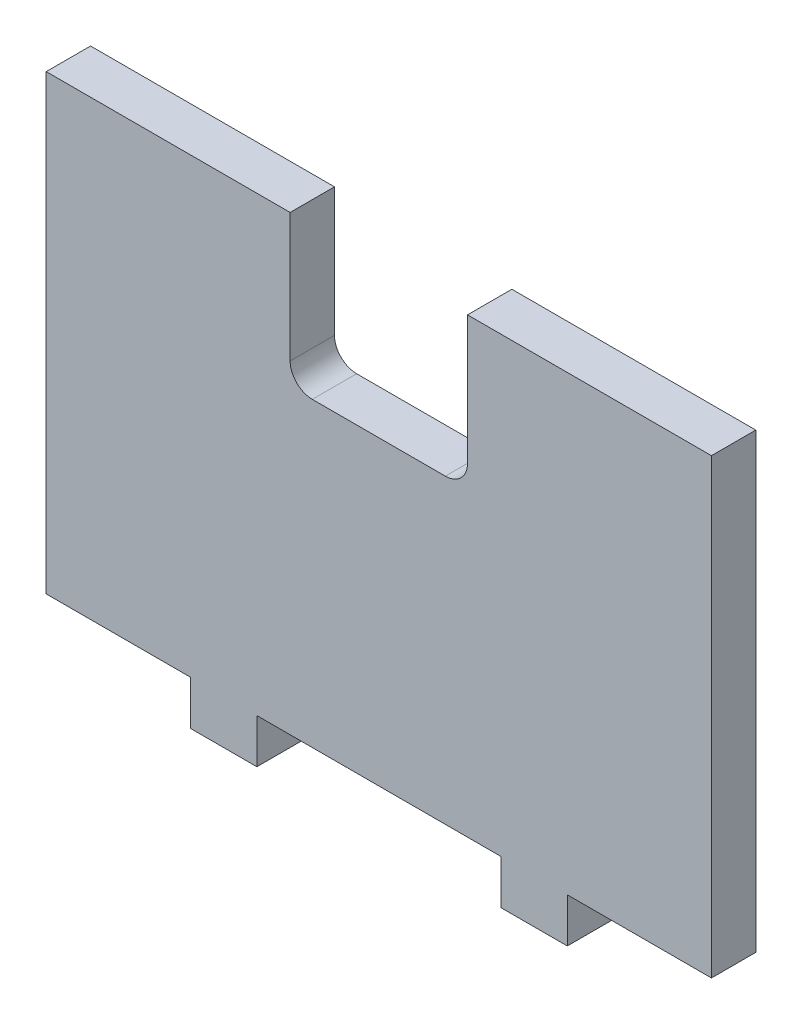
ISO-10303-21;
HEADER;
FILE_DESCRIPTION(('STEP AP214'),'2;1');
FILE_NAME('part.step','',(''),(''),'','','');
FILE_SCHEMA(('AUTOMOTIVE_DESIGN { 1 0 10303 214 1 1 1 1 }'));
ENDSEC;
DATA;
#1=APPLICATION_CONTEXT('core data for automotive mechanical design processes');
#2=APPLICATION_PROTOCOL_DEFINITION('international standard','automotive_design',2000,#1);
#3=PRODUCT_CONTEXT('',#1,'mechanical');
#4=PRODUCT('Part','Part','',(#3));
#5=PRODUCT_RELATED_PRODUCT_CATEGORY('part','',(#4));
#6=PRODUCT_DEFINITION_FORMATION('','',#4);
#7=PRODUCT_DEFINITION_CONTEXT('part definition',#1,'design');
#8=PRODUCT_DEFINITION('design','',#6,#7);
#9=PRODUCT_DEFINITION_SHAPE('','',#8);
#10=(LENGTH_UNIT() NAMED_UNIT(*) SI_UNIT(.MILLI.,.METRE.));
#11=(NAMED_UNIT(*) PLANE_ANGLE_UNIT() SI_UNIT($,.RADIAN.));
#12=(NAMED_UNIT(*) SI_UNIT($,.STERADIAN.) SOLID_ANGLE_UNIT());
#13=UNCERTAINTY_MEASURE_WITH_UNIT(LENGTH_MEASURE(1.E-05),#10,'distance_accuracy_value','');
#14=(GEOMETRIC_REPRESENTATION_CONTEXT(3) GLOBAL_UNCERTAINTY_ASSIGNED_CONTEXT((#13)) GLOBAL_UNIT_ASSIGNED_CONTEXT((#10,
#11,#12)) REPRESENTATION_CONTEXT('',''));
#15=CARTESIAN_POINT('',(0.,0.,0.));
#16=DIRECTION('',(0.,0.,1.));
#17=DIRECTION('',(1.,0.,0.));
#18=AXIS2_PLACEMENT_3D('',#15,#16,#17);
#19=CARTESIAN_POINT('',(-95.25,142.24,-12.7));
#20=DIRECTION('',(0.,1.,0.));
#21=DIRECTION('',(0.,0.,1.));
#22=AXIS2_PLACEMENT_3D('',#19,#20,#21);
#23=PLANE('',#22);
#24=DIRECTION('',(0.,0.,1.));
#25=VECTOR('',#24,1.);
#26=CARTESIAN_POINT('',(-25.3999999999998,142.24,-12.7));
#27=LINE('',#26,#25);
#28=CARTESIAN_POINT('',(-25.3999999999998,142.24,-12.7));
#29=VERTEX_POINT('',#28);
#30=CARTESIAN_POINT('',(-25.3999999999998,142.24,0.));
#31=VERTEX_POINT('',#30);
#32=EDGE_CURVE('E180',#29,#31,#27,.T.);
#33=ORIENTED_EDGE('',*,*,#32,.F.);
#34=DIRECTION('',(-1.,0.,0.));
#35=VECTOR('',#34,1.);
#36=CARTESIAN_POINT('',(-95.25,142.24,-12.7));
#37=LINE('',#36,#35);
#38=CARTESIAN_POINT('',(-95.25,142.24,-12.7));
#39=VERTEX_POINT('',#38);
#40=EDGE_CURVE('E186',#29,#39,#37,.T.);
#41=ORIENTED_EDGE('',*,*,#40,.T.);
#42=DIRECTION('',(0.,0.,1.));
#43=VECTOR('',#42,1.);
#44=CARTESIAN_POINT('',(-95.25,142.24,-12.7));
#45=LINE('',#44,#43);
#46=CARTESIAN_POINT('',(-95.25,142.24,0.));
#47=VERTEX_POINT('',#46);
#48=EDGE_CURVE('E231',#39,#47,#45,.T.);
#49=ORIENTED_EDGE('',*,*,#48,.T.);
#50=DIRECTION('',(-1.,0.,0.));
#51=VECTOR('',#50,1.);
#52=CARTESIAN_POINT('',(-95.25,142.24,0.));
#53=LINE('',#52,#51);
#54=EDGE_CURVE('E227',#31,#47,#53,.T.);
#55=ORIENTED_EDGE('',*,*,#54,.F.);
#56=EDGE_LOOP('',(#33,#41,#49,#55));
#57=FACE_BOUND('',#56,.T.);
#58=ADVANCED_FACE('F33',(#57),#23,.T.);
#59=CARTESIAN_POINT('',(-95.25,142.24,-12.7));
#60=DIRECTION('',(-1.,0.,0.));
#61=DIRECTION('',(0.,-1.,0.));
#62=AXIS2_PLACEMENT_3D('',#59,#60,#61);
#63=PLANE('',#62);
#64=DIRECTION('',(0.,-1.,0.));
#65=VECTOR('',#64,1.);
#66=CARTESIAN_POINT('',(-95.25,142.24,0.));
#67=LINE('',#66,#65);
#68=CARTESIAN_POINT('',(-95.25,12.7,0.));
#69=VERTEX_POINT('',#68);
#70=EDGE_CURVE('E194',#47,#69,#67,.T.);
#71=ORIENTED_EDGE('',*,*,#70,.F.);
#72=ORIENTED_EDGE('',*,*,#48,.F.);
#73=DIRECTION('',(0.,-1.,0.));
#74=VECTOR('',#73,1.);
#75=CARTESIAN_POINT('',(-95.25,142.24,-12.7));
#76=LINE('',#75,#74);
#77=CARTESIAN_POINT('',(-95.25,12.7,-12.7));
#78=VERTEX_POINT('',#77);
#79=EDGE_CURVE('E230',#39,#78,#76,.T.);
#80=ORIENTED_EDGE('',*,*,#79,.T.);
#81=DIRECTION('',(0.,0.,1.));
#82=VECTOR('',#81,1.);
#83=CARTESIAN_POINT('',(-95.25,12.7,-12.7));
#84=LINE('',#83,#82);
#85=EDGE_CURVE('E185',#78,#69,#84,.T.);
#86=ORIENTED_EDGE('',*,*,#85,.T.);
#87=EDGE_LOOP('',(#71,#72,#80,#86));
#88=FACE_BOUND('',#87,.T.);
#89=ADVANCED_FACE('F283',(#88),#63,.T.);
#90=DIRECTION('',(0.,0.,1.));
#91=VECTOR('',#90,1.);
#92=CARTESIAN_POINT('',(25.3999999999998,142.24,-12.7));
#93=LINE('',#92,#91);
#94=CARTESIAN_POINT('',(25.3999999999998,142.24,-12.7));
#95=VERTEX_POINT('',#94);
#96=CARTESIAN_POINT('',(25.3999999999998,142.24,0.));
#97=VERTEX_POINT('',#96);
#98=EDGE_CURVE('E170',#95,#97,#93,.T.);
#99=ORIENTED_EDGE('',*,*,#98,.T.);
#100=CARTESIAN_POINT('',(95.25,142.24,0.));
#101=VERTEX_POINT('',#100);
#102=EDGE_CURVE('E228',#101,#97,#53,.T.);
#103=ORIENTED_EDGE('',*,*,#102,.F.);
#104=DIRECTION('',(0.,0.,1.));
#105=VECTOR('',#104,1.);
#106=CARTESIAN_POINT('',(95.25,142.24,-12.7));
#107=LINE('',#106,#105);
#108=CARTESIAN_POINT('',(95.25,142.24,-12.7));
#109=VERTEX_POINT('',#108);
#110=EDGE_CURVE('E183',#109,#101,#107,.T.);
#111=ORIENTED_EDGE('',*,*,#110,.F.);
#112=EDGE_CURVE('E163',#109,#95,#37,.T.);
#113=ORIENTED_EDGE('',*,*,#112,.T.);
#114=EDGE_LOOP('',(#99,#103,#111,#113));
#115=FACE_BOUND('',#114,.T.);
#116=ADVANCED_FACE('F182',(#115),#23,.T.);
#117=CARTESIAN_POINT('',(95.25,142.24,-12.7));
#118=DIRECTION('',(1.,0.,0.));
#119=DIRECTION('',(0.,1.,0.));
#120=AXIS2_PLACEMENT_3D('',#117,#118,#119);
#121=PLANE('',#120);
#122=DIRECTION('',(0.,1.,0.));
#123=VECTOR('',#122,1.);
#124=CARTESIAN_POINT('',(95.25,142.24,0.));
#125=LINE('',#124,#123);
#126=CARTESIAN_POINT('',(95.25,12.7,0.));
#127=VERTEX_POINT('',#126);
#128=EDGE_CURVE('E224',#127,#101,#125,.T.);
#129=ORIENTED_EDGE('',*,*,#128,.F.);
#130=DIRECTION('',(0.,0.,1.));
#131=VECTOR('',#130,1.);
#132=CARTESIAN_POINT('',(95.25,12.7,-12.7));
#133=LINE('',#132,#131);
#134=CARTESIAN_POINT('',(95.25,12.7,-12.7));
#135=VERTEX_POINT('',#134);
#136=EDGE_CURVE('E236',#135,#127,#133,.T.);
#137=ORIENTED_EDGE('',*,*,#136,.F.);
#138=DIRECTION('',(0.,1.,0.));
#139=VECTOR('',#138,1.);
#140=CARTESIAN_POINT('',(95.25,142.24,-12.7));
#141=LINE('',#140,#139);
#142=EDGE_CURVE('E190',#135,#109,#141,.T.);
#143=ORIENTED_EDGE('',*,*,#142,.T.);
#144=ORIENTED_EDGE('',*,*,#110,.T.);
#145=EDGE_LOOP('',(#129,#137,#143,#144));
#146=FACE_BOUND('',#145,.T.);
#147=ADVANCED_FACE('F294',(#146),#121,.T.);
#148=CARTESIAN_POINT('',(53.975,12.7,-12.7));
#149=DIRECTION('',(0.,-1.,0.));
#150=DIRECTION('',(0.,0.,-1.));
#151=AXIS2_PLACEMENT_3D('',#148,#149,#150);
#152=PLANE('',#151);
#153=DIRECTION('',(1.,0.,0.));
#154=VECTOR('',#153,1.);
#155=CARTESIAN_POINT('',(53.975,12.7,0.));
#156=LINE('',#155,#154);
#157=CARTESIAN_POINT('',(53.975,12.7,0.));
#158=VERTEX_POINT('',#157);
#159=EDGE_CURVE('E221',#158,#127,#156,.T.);
#160=ORIENTED_EDGE('',*,*,#159,.F.);
#161=DIRECTION('',(0.,0.,1.));
#162=VECTOR('',#161,1.);
#163=CARTESIAN_POINT('',(53.975,12.7,-12.7));
#164=LINE('',#163,#162);
#165=CARTESIAN_POINT('',(53.975,12.7,-12.7));
#166=VERTEX_POINT('',#165);
#167=EDGE_CURVE('E238',#166,#158,#164,.T.);
#168=ORIENTED_EDGE('',*,*,#167,.F.);
#169=DIRECTION('',(1.,0.,0.));
#170=VECTOR('',#169,1.);
#171=CARTESIAN_POINT('',(53.975,12.7,-12.7));
#172=LINE('',#171,#170);
#173=EDGE_CURVE('E376',#166,#135,#172,.T.);
#174=ORIENTED_EDGE('',*,*,#173,.T.);
#175=ORIENTED_EDGE('',*,*,#136,.T.);
#176=EDGE_LOOP('',(#160,#168,#174,#175));
#177=FACE_BOUND('',#176,.T.);
#178=ADVANCED_FACE('F298',(#177),#152,.T.);
#179=CARTESIAN_POINT('',(53.975,0.,-12.7));
#180=DIRECTION('',(1.,0.,0.));
#181=DIRECTION('',(0.,0.,-1.));
#182=AXIS2_PLACEMENT_3D('',#179,#180,#181);
#183=PLANE('',#182);
#184=DIRECTION('',(0.,1.,0.));
#185=VECTOR('',#184,1.);
#186=CARTESIAN_POINT('',(53.975,0.,0.));
#187=LINE('',#186,#185);
#188=CARTESIAN_POINT('',(53.975,0.,0.));
#189=VERTEX_POINT('',#188);
#190=EDGE_CURVE('E218',#189,#158,#187,.T.);
#191=ORIENTED_EDGE('',*,*,#190,.F.);
#192=DIRECTION('',(0.,0.,1.));
#193=VECTOR('',#192,1.);
#194=CARTESIAN_POINT('',(53.975,0.,-12.7));
#195=LINE('',#194,#193);
#196=CARTESIAN_POINT('',(53.975,0.,-12.7));
#197=VERTEX_POINT('',#196);
#198=EDGE_CURVE('E240',#197,#189,#195,.T.);
#199=ORIENTED_EDGE('',*,*,#198,.F.);
#200=DIRECTION('',(0.,1.,0.));
#201=VECTOR('',#200,1.);
#202=CARTESIAN_POINT('',(53.975,0.,-12.7));
#203=LINE('',#202,#201);
#204=EDGE_CURVE('E374',#197,#166,#203,.T.);
#205=ORIENTED_EDGE('',*,*,#204,.T.);
#206=ORIENTED_EDGE('',*,*,#167,.T.);
#207=EDGE_LOOP('',(#191,#199,#205,#206));
#208=FACE_BOUND('',#207,.T.);
#209=ADVANCED_FACE('F303',(#208),#183,.T.);
#210=CARTESIAN_POINT('',(53.975,0.,-12.7));
#211=DIRECTION('',(0.,-1.,0.));
#212=DIRECTION('',(0.,0.,-1.));
#213=AXIS2_PLACEMENT_3D('',#210,#211,#212);
#214=PLANE('',#213);
#215=DIRECTION('',(1.,0.,0.));
#216=VECTOR('',#215,1.);
#217=CARTESIAN_POINT('',(53.975,0.,0.));
#218=LINE('',#217,#216);
#219=CARTESIAN_POINT('',(34.9249999999999,0.,0.));
#220=VERTEX_POINT('',#219);
#221=EDGE_CURVE('E215',#220,#189,#218,.T.);
#222=ORIENTED_EDGE('',*,*,#221,.F.);
#223=DIRECTION('',(0.,0.,1.));
#224=VECTOR('',#223,1.);
#225=CARTESIAN_POINT('',(34.9249999999999,0.,-12.7));
#226=LINE('',#225,#224);
#227=CARTESIAN_POINT('',(34.9249999999999,0.,-12.7));
#228=VERTEX_POINT('',#227);
#229=EDGE_CURVE('E242',#228,#220,#226,.T.);
#230=ORIENTED_EDGE('',*,*,#229,.F.);
#231=DIRECTION('',(1.,0.,0.));
#232=VECTOR('',#231,1.);
#233=CARTESIAN_POINT('',(53.975,0.,-12.7));
#234=LINE('',#233,#232);
#235=EDGE_CURVE('E371',#228,#197,#234,.T.);
#236=ORIENTED_EDGE('',*,*,#235,.T.);
#237=ORIENTED_EDGE('',*,*,#198,.T.);
#238=EDGE_LOOP('',(#222,#230,#236,#237));
#239=FACE_BOUND('',#238,.T.);
#240=ADVANCED_FACE('F310',(#239),#214,.T.);
#241=CARTESIAN_POINT('',(34.9249999999999,0.,-12.7));
#242=DIRECTION('',(-1.,0.,0.));
#243=DIRECTION('',(0.,0.,1.));
#244=AXIS2_PLACEMENT_3D('',#241,#242,#243);
#245=PLANE('',#244);
#246=DIRECTION('',(0.,-1.,0.));
#247=VECTOR('',#246,1.);
#248=CARTESIAN_POINT('',(34.9249999999999,0.,0.));
#249=LINE('',#248,#247);
#250=CARTESIAN_POINT('',(34.9249999999999,12.7,0.));
#251=VERTEX_POINT('',#250);
#252=EDGE_CURVE('E212',#251,#220,#249,.T.);
#253=ORIENTED_EDGE('',*,*,#252,.F.);
#254=DIRECTION('',(0.,0.,1.));
#255=VECTOR('',#254,1.);
#256=CARTESIAN_POINT('',(34.9249999999999,12.7,-12.7));
#257=LINE('',#256,#255);
#258=CARTESIAN_POINT('',(34.9249999999999,12.7,-12.7));
#259=VERTEX_POINT('',#258);
#260=EDGE_CURVE('E244',#259,#251,#257,.T.);
#261=ORIENTED_EDGE('',*,*,#260,.F.);
#262=DIRECTION('',(0.,-1.,0.));
#263=VECTOR('',#262,1.);
#264=CARTESIAN_POINT('',(34.9249999999999,0.,-12.7));
#265=LINE('',#264,#263);
#266=EDGE_CURVE('E368',#259,#228,#265,.T.);
#267=ORIENTED_EDGE('',*,*,#266,.T.);
#268=ORIENTED_EDGE('',*,*,#229,.T.);
#269=EDGE_LOOP('',(#253,#261,#267,#268));
#270=FACE_BOUND('',#269,.T.);
#271=ADVANCED_FACE('F314',(#270),#245,.T.);
#272=CARTESIAN_POINT('',(-34.9250000000001,12.7,-12.7));
#273=DIRECTION('',(0.,-1.,0.));
#274=DIRECTION('',(0.,0.,-1.));
#275=AXIS2_PLACEMENT_3D('',#272,#273,#274);
#276=PLANE('',#275);
#277=DIRECTION('',(1.,0.,0.));
#278=VECTOR('',#277,1.);
#279=CARTESIAN_POINT('',(-34.9250000000001,12.7,0.));
#280=LINE('',#279,#278);
#281=CARTESIAN_POINT('',(-34.9250000000001,12.7,0.));
#282=VERTEX_POINT('',#281);
#283=EDGE_CURVE('E209',#282,#251,#280,.T.);
#284=ORIENTED_EDGE('',*,*,#283,.F.);
#285=DIRECTION('',(0.,0.,1.));
#286=VECTOR('',#285,1.);
#287=CARTESIAN_POINT('',(-34.9250000000001,12.7,-12.7));
#288=LINE('',#287,#286);
#289=CARTESIAN_POINT('',(-34.9250000000001,12.7,-12.7));
#290=VERTEX_POINT('',#289);
#291=EDGE_CURVE('E246',#290,#282,#288,.T.);
#292=ORIENTED_EDGE('',*,*,#291,.F.);
#293=DIRECTION('',(1.,0.,0.));
#294=VECTOR('',#293,1.);
#295=CARTESIAN_POINT('',(-34.9250000000001,12.7,-12.7));
#296=LINE('',#295,#294);
#297=EDGE_CURVE('E365',#290,#259,#296,.T.);
#298=ORIENTED_EDGE('',*,*,#297,.T.);
#299=ORIENTED_EDGE('',*,*,#260,.T.);
#300=EDGE_LOOP('',(#284,#292,#298,#299));
#301=FACE_BOUND('',#300,.T.);
#302=ADVANCED_FACE('F318',(#301),#276,.T.);
#303=CARTESIAN_POINT('',(-34.9250000000001,0.,-12.7));
#304=DIRECTION('',(1.,0.,0.));
#305=DIRECTION('',(0.,0.,-1.));
#306=AXIS2_PLACEMENT_3D('',#303,#304,#305);
#307=PLANE('',#306);
#308=DIRECTION('',(0.,1.,0.));
#309=VECTOR('',#308,1.);
#310=CARTESIAN_POINT('',(-34.9250000000001,0.,0.));
#311=LINE('',#310,#309);
#312=CARTESIAN_POINT('',(-34.9250000000001,0.,0.));
#313=VERTEX_POINT('',#312);
#314=EDGE_CURVE('E206',#313,#282,#311,.T.);
#315=ORIENTED_EDGE('',*,*,#314,.F.);
#316=DIRECTION('',(0.,0.,1.));
#317=VECTOR('',#316,1.);
#318=CARTESIAN_POINT('',(-34.9250000000001,0.,-12.7));
#319=LINE('',#318,#317);
#320=CARTESIAN_POINT('',(-34.9250000000001,0.,-12.7));
#321=VERTEX_POINT('',#320);
#322=EDGE_CURVE('E248',#321,#313,#319,.T.);
#323=ORIENTED_EDGE('',*,*,#322,.F.);
#324=DIRECTION('',(0.,1.,0.));
#325=VECTOR('',#324,1.);
#326=CARTESIAN_POINT('',(-34.9250000000001,0.,-12.7));
#327=LINE('',#326,#325);
#328=EDGE_CURVE('E362',#321,#290,#327,.T.);
#329=ORIENTED_EDGE('',*,*,#328,.T.);
#330=ORIENTED_EDGE('',*,*,#291,.T.);
#331=EDGE_LOOP('',(#315,#323,#329,#330));
#332=FACE_BOUND('',#331,.T.);
#333=ADVANCED_FACE('F322',(#332),#307,.T.);
#334=CARTESIAN_POINT('',(-34.9250000000001,0.,-12.7));
#335=DIRECTION('',(0.,-1.,0.));
#336=DIRECTION('',(0.,0.,-1.));
#337=AXIS2_PLACEMENT_3D('',#334,#335,#336);
#338=PLANE('',#337);
#339=DIRECTION('',(1.,0.,0.));
#340=VECTOR('',#339,1.);
#341=CARTESIAN_POINT('',(-34.9250000000001,0.,0.));
#342=LINE('',#341,#340);
#343=CARTESIAN_POINT('',(-53.9750000000001,0.,0.));
#344=VERTEX_POINT('',#343);
#345=EDGE_CURVE('E203',#344,#313,#342,.T.);
#346=ORIENTED_EDGE('',*,*,#345,.F.);
#347=DIRECTION('',(0.,0.,1.));
#348=VECTOR('',#347,1.);
#349=CARTESIAN_POINT('',(-53.9750000000001,0.,-12.7));
#350=LINE('',#349,#348);
#351=CARTESIAN_POINT('',(-53.9750000000001,0.,-12.7));
#352=VERTEX_POINT('',#351);
#353=EDGE_CURVE('E250',#352,#344,#350,.T.);
#354=ORIENTED_EDGE('',*,*,#353,.F.);
#355=DIRECTION('',(1.,0.,0.));
#356=VECTOR('',#355,1.);
#357=CARTESIAN_POINT('',(-34.9250000000001,0.,-12.7));
#358=LINE('',#357,#356);
#359=EDGE_CURVE('E359',#352,#321,#358,.T.);
#360=ORIENTED_EDGE('',*,*,#359,.T.);
#361=ORIENTED_EDGE('',*,*,#322,.T.);
#362=EDGE_LOOP('',(#346,#354,#360,#361));
#363=FACE_BOUND('',#362,.T.);
#364=ADVANCED_FACE('F326',(#363),#338,.T.);
#365=CARTESIAN_POINT('',(-53.9750000000001,0.,-12.7));
#366=DIRECTION('',(-1.,0.,0.));
#367=DIRECTION('',(0.,0.,1.));
#368=AXIS2_PLACEMENT_3D('',#365,#366,#367);
#369=PLANE('',#368);
#370=DIRECTION('',(0.,-1.,0.));
#371=VECTOR('',#370,1.);
#372=CARTESIAN_POINT('',(-53.9750000000001,0.,0.));
#373=LINE('',#372,#371);
#374=CARTESIAN_POINT('',(-53.9750000000001,12.7,0.));
#375=VERTEX_POINT('',#374);
#376=EDGE_CURVE('E200',#375,#344,#373,.T.);
#377=ORIENTED_EDGE('',*,*,#376,.F.);
#378=DIRECTION('',(0.,0.,1.));
#379=VECTOR('',#378,1.);
#380=CARTESIAN_POINT('',(-53.9750000000001,12.7,-12.7));
#381=LINE('',#380,#379);
#382=CARTESIAN_POINT('',(-53.9750000000001,12.7,-12.7));
#383=VERTEX_POINT('',#382);
#384=EDGE_CURVE('E188',#383,#375,#381,.T.);
#385=ORIENTED_EDGE('',*,*,#384,.F.);
#386=DIRECTION('',(0.,-1.,0.));
#387=VECTOR('',#386,1.);
#388=CARTESIAN_POINT('',(-53.9750000000001,0.,-12.7));
#389=LINE('',#388,#387);
#390=EDGE_CURVE('E353',#383,#352,#389,.T.);
#391=ORIENTED_EDGE('',*,*,#390,.T.);
#392=ORIENTED_EDGE('',*,*,#353,.T.);
#393=EDGE_LOOP('',(#377,#385,#391,#392));
#394=FACE_BOUND('',#393,.T.);
#395=ADVANCED_FACE('F330',(#394),#369,.T.);
#396=CARTESIAN_POINT('',(-95.25,12.7,-12.7));
#397=DIRECTION('',(0.,-1.,0.));
#398=DIRECTION('',(0.,0.,-1.));
#399=AXIS2_PLACEMENT_3D('',#396,#397,#398);
#400=PLANE('',#399);
#401=DIRECTION('',(1.,0.,0.));
#402=VECTOR('',#401,1.);
#403=CARTESIAN_POINT('',(-95.25,12.7,0.));
#404=LINE('',#403,#402);
#405=EDGE_CURVE('E197',#69,#375,#404,.T.);
#406=ORIENTED_EDGE('',*,*,#405,.F.);
#407=ORIENTED_EDGE('',*,*,#85,.F.);
#408=DIRECTION('',(1.,0.,0.));
#409=VECTOR('',#408,1.);
#410=CARTESIAN_POINT('',(-95.25,12.7,-12.7));
#411=LINE('',#410,#409);
#412=EDGE_CURVE('E351',#78,#383,#411,.T.);
#413=ORIENTED_EDGE('',*,*,#412,.T.);
#414=ORIENTED_EDGE('',*,*,#384,.T.);
#415=EDGE_LOOP('',(#406,#407,#413,#414));
#416=FACE_BOUND('',#415,.T.);
#417=ADVANCED_FACE('F334',(#416),#400,.T.);
#418=CARTESIAN_POINT('',(-95.25,12.7,-12.7));
#419=DIRECTION('',(0.,0.,1.));
#420=DIRECTION('',(1.,0.,0.));
#421=AXIS2_PLACEMENT_3D('',#418,#419,#420);
#422=PLANE('',#421);
#423=ORIENTED_EDGE('',*,*,#40,.F.);
#424=DIRECTION('',(0.,-1.,0.));
#425=VECTOR('',#424,1.);
#426=CARTESIAN_POINT('',(-25.3999999999998,142.24,-12.7));
#427=LINE('',#426,#425);
#428=CARTESIAN_POINT('',(-25.3999999999998,105.41,-12.7));
#429=VERTEX_POINT('',#428);
#430=EDGE_CURVE('E394',#29,#429,#427,.T.);
#431=ORIENTED_EDGE('',*,*,#430,.T.);
#432=CARTESIAN_POINT('',(-19.0499999999998,105.41,-12.7));
#433=DIRECTION('',(0.,0.,1.));
#434=DIRECTION('',(1.,0.,0.));
#435=AXIS2_PLACEMENT_3D('',#432,#433,#434);
#436=CIRCLE('',#435,6.35);
#437=CARTESIAN_POINT('',(-19.0499999999998,99.06,-12.7));
#438=VERTEX_POINT('',#437);
#439=EDGE_CURVE('E11',#429,#438,#436,.T.);
#440=ORIENTED_EDGE('',*,*,#439,.T.);
#441=DIRECTION('',(1.,0.,0.));
#442=VECTOR('',#441,1.);
#443=CARTESIAN_POINT('',(-25.3999999999998,99.06,-12.7));
#444=LINE('',#443,#442);
#445=CARTESIAN_POINT('',(19.0500000000001,99.06,-12.7));
#446=VERTEX_POINT('',#445);
#447=EDGE_CURVE('E171',#438,#446,#444,.T.);
#448=ORIENTED_EDGE('',*,*,#447,.T.);
#449=CARTESIAN_POINT('',(19.0500000000001,105.41,-12.7));
#450=DIRECTION('',(0.,0.,1.));
#451=DIRECTION('',(1.,0.,0.));
#452=AXIS2_PLACEMENT_3D('',#449,#450,#451);
#453=CIRCLE('',#452,6.35);
#454=CARTESIAN_POINT('',(25.4000000000001,105.41,-12.7));
#455=VERTEX_POINT('',#454);
#456=EDGE_CURVE('E166',#446,#455,#453,.T.);
#457=ORIENTED_EDGE('',*,*,#456,.T.);
#458=DIRECTION('',(0.,1.,0.));
#459=VECTOR('',#458,1.);
#460=CARTESIAN_POINT('',(25.3999999999998,142.24,-12.7));
#461=LINE('',#460,#459);
#462=EDGE_CURVE('E157',#455,#95,#461,.T.);
#463=ORIENTED_EDGE('',*,*,#462,.T.);
#464=ORIENTED_EDGE('',*,*,#112,.F.);
#465=ORIENTED_EDGE('',*,*,#142,.F.);
#466=ORIENTED_EDGE('',*,*,#173,.F.);
#467=ORIENTED_EDGE('',*,*,#204,.F.);
#468=ORIENTED_EDGE('',*,*,#235,.F.);
#469=ORIENTED_EDGE('',*,*,#266,.F.);
#470=ORIENTED_EDGE('',*,*,#297,.F.);
#471=ORIENTED_EDGE('',*,*,#328,.F.);
#472=ORIENTED_EDGE('',*,*,#359,.F.);
#473=ORIENTED_EDGE('',*,*,#390,.F.);
#474=ORIENTED_EDGE('',*,*,#412,.F.);
#475=ORIENTED_EDGE('',*,*,#79,.F.);
#476=EDGE_LOOP('',(#423,#431,#440,#448,#457,#463,#464,#465,#466,#467,#468,#469,#470,#471,#472,
#473,#474,#475));
#477=FACE_BOUND('',#476,.T.);
#478=ADVANCED_FACE('F160',(#477),#422,.F.);
#479=CARTESIAN_POINT('',(-95.25,12.7,0.));
#480=DIRECTION('',(0.,0.,1.));
#481=DIRECTION('',(1.,0.,0.));
#482=AXIS2_PLACEMENT_3D('',#479,#480,#481);
#483=PLANE('',#482);
#484=DIRECTION('',(0.,-1.,0.));
#485=VECTOR('',#484,1.);
#486=CARTESIAN_POINT('',(-25.3999999999998,142.24,0.));
#487=LINE('',#486,#485);
#488=CARTESIAN_POINT('',(-25.3999999999998,105.41,0.));
#489=VERTEX_POINT('',#488);
#490=EDGE_CURVE('E271',#31,#489,#487,.T.);
#491=ORIENTED_EDGE('',*,*,#490,.F.);
#492=ORIENTED_EDGE('',*,*,#54,.T.);
#493=ORIENTED_EDGE('',*,*,#70,.T.);
#494=ORIENTED_EDGE('',*,*,#405,.T.);
#495=ORIENTED_EDGE('',*,*,#376,.T.);
#496=ORIENTED_EDGE('',*,*,#345,.T.);
#497=ORIENTED_EDGE('',*,*,#314,.T.);
#498=ORIENTED_EDGE('',*,*,#283,.T.);
#499=ORIENTED_EDGE('',*,*,#252,.T.);
#500=ORIENTED_EDGE('',*,*,#221,.T.);
#501=ORIENTED_EDGE('',*,*,#190,.T.);
#502=ORIENTED_EDGE('',*,*,#159,.T.);
#503=ORIENTED_EDGE('',*,*,#128,.T.);
#504=ORIENTED_EDGE('',*,*,#102,.T.);
#505=DIRECTION('',(0.,1.,0.));
#506=VECTOR('',#505,1.);
#507=CARTESIAN_POINT('',(25.3999999999998,142.24,0.));
#508=LINE('',#507,#506);
#509=CARTESIAN_POINT('',(25.4000000000001,105.41,0.));
#510=VERTEX_POINT('',#509);
#511=EDGE_CURVE('E176',#510,#97,#508,.T.);
#512=ORIENTED_EDGE('',*,*,#511,.F.);
#513=CARTESIAN_POINT('',(19.0500000000001,105.41,0.));
#514=DIRECTION('',(0.,0.,1.));
#515=DIRECTION('',(1.,0.,0.));
#516=AXIS2_PLACEMENT_3D('',#513,#514,#515);
#517=CIRCLE('',#516,6.35);
#518=CARTESIAN_POINT('',(19.0500000000001,99.06,0.));
#519=VERTEX_POINT('',#518);
#520=EDGE_CURVE('E260',#510,#519,#517,.F.);
#521=ORIENTED_EDGE('',*,*,#520,.T.);
#522=DIRECTION('',(1.,0.,0.));
#523=VECTOR('',#522,1.);
#524=CARTESIAN_POINT('',(-25.3999999999998,99.06,0.));
#525=LINE('',#524,#523);
#526=CARTESIAN_POINT('',(-19.0499999999998,99.06,0.));
#527=VERTEX_POINT('',#526);
#528=EDGE_CURVE('E264',#527,#519,#525,.T.);
#529=ORIENTED_EDGE('',*,*,#528,.F.);
#530=CARTESIAN_POINT('',(-19.0499999999998,105.41,0.));
#531=DIRECTION('',(0.,0.,1.));
#532=DIRECTION('',(1.,0.,0.));
#533=AXIS2_PLACEMENT_3D('',#530,#531,#532);
#534=CIRCLE('',#533,6.35);
#535=EDGE_CURVE('E41',#527,#489,#534,.F.);
#536=ORIENTED_EDGE('',*,*,#535,.T.);
#537=EDGE_LOOP('',(#491,#492,#493,#494,#495,#496,#497,#498,#499,#500,#501,#502,#503,#504,#512,
#521,#529,#536));
#538=FACE_BOUND('',#537,.T.);
#539=ADVANCED_FACE('F263',(#538),#483,.T.);
#540=CARTESIAN_POINT('',(-25.3999999999998,142.24,-12.7));
#541=DIRECTION('',(-1.,0.,0.));
#542=DIRECTION('',(0.,-1.,0.));
#543=AXIS2_PLACEMENT_3D('',#540,#541,#542);
#544=PLANE('',#543);
#545=ORIENTED_EDGE('',*,*,#490,.T.);
#546=DIRECTION('',(0.,0.,1.));
#547=VECTOR('',#546,1.);
#548=CARTESIAN_POINT('',(-25.3999999999998,105.41,-12.7));
#549=LINE('',#548,#547);
#550=EDGE_CURVE('E48',#489,#429,#549,.F.);
#551=ORIENTED_EDGE('',*,*,#550,.T.);
#552=ORIENTED_EDGE('',*,*,#430,.F.);
#553=ORIENTED_EDGE('',*,*,#32,.T.);
#554=EDGE_LOOP('',(#545,#551,#552,#553));
#555=FACE_BOUND('',#554,.T.);
#556=ADVANCED_FACE('F399',(#555),#544,.F.);
#557=CARTESIAN_POINT('',(25.3999999999998,142.24,-12.7));
#558=DIRECTION('',(1.,0.,0.));
#559=DIRECTION('',(0.,1.,0.));
#560=AXIS2_PLACEMENT_3D('',#557,#558,#559);
#561=PLANE('',#560);
#562=ORIENTED_EDGE('',*,*,#462,.F.);
#563=DIRECTION('',(0.,0.,1.));
#564=VECTOR('',#563,1.);
#565=CARTESIAN_POINT('',(25.4000000000001,105.41,0.));
#566=LINE('',#565,#564);
#567=EDGE_CURVE('E234',#455,#510,#566,.T.);
#568=ORIENTED_EDGE('',*,*,#567,.T.);
#569=ORIENTED_EDGE('',*,*,#511,.T.);
#570=ORIENTED_EDGE('',*,*,#98,.F.);
#571=EDGE_LOOP('',(#562,#568,#569,#570));
#572=FACE_BOUND('',#571,.T.);
#573=ADVANCED_FACE('F174',(#572),#561,.F.);
#574=CARTESIAN_POINT('',(-25.3999999999998,99.06,-12.7));
#575=DIRECTION('',(0.,-1.,0.));
#576=DIRECTION('',(0.,0.,-1.));
#577=AXIS2_PLACEMENT_3D('',#574,#575,#576);
#578=PLANE('',#577);
#579=ORIENTED_EDGE('',*,*,#528,.T.);
#580=DIRECTION('',(0.,0.,1.));
#581=VECTOR('',#580,1.);
#582=CARTESIAN_POINT('',(19.0500000000001,99.06,-12.7));
#583=LINE('',#582,#581);
#584=EDGE_CURVE('E257',#519,#446,#583,.F.);
#585=ORIENTED_EDGE('',*,*,#584,.T.);
#586=ORIENTED_EDGE('',*,*,#447,.F.);
#587=DIRECTION('',(0.,0.,1.));
#588=VECTOR('',#587,1.);
#589=CARTESIAN_POINT('',(-19.0499999999998,99.06,0.));
#590=LINE('',#589,#588);
#591=EDGE_CURVE('E254',#438,#527,#590,.T.);
#592=ORIENTED_EDGE('',*,*,#591,.T.);
#593=EDGE_LOOP('',(#579,#585,#586,#592));
#594=FACE_BOUND('',#593,.T.);
#595=ADVANCED_FACE('F268',(#594),#578,.F.);
#596=CARTESIAN_POINT('',(19.0500000000001,105.41,-12.7));
#597=DIRECTION('',(0.,0.,-1.));
#598=DIRECTION('',(-1.,0.,0.));
#599=AXIS2_PLACEMENT_3D('',#596,#597,#598);
#600=CYLINDRICAL_SURFACE('',#599,6.35);
#601=ORIENTED_EDGE('',*,*,#456,.F.);
#602=ORIENTED_EDGE('',*,*,#584,.F.);
#603=ORIENTED_EDGE('',*,*,#520,.F.);
#604=ORIENTED_EDGE('',*,*,#567,.F.);
#605=EDGE_LOOP('',(#601,#602,#603,#604));
#606=FACE_BOUND('',#605,.T.);
#607=ADVANCED_FACE('F273',(#606),#600,.F.);
#608=CARTESIAN_POINT('',(-19.0499999999998,105.41,-12.7));
#609=DIRECTION('',(0.,0.,-1.));
#610=DIRECTION('',(-1.,0.,0.));
#611=AXIS2_PLACEMENT_3D('',#608,#609,#610);
#612=CYLINDRICAL_SURFACE('',#611,6.35);
#613=ORIENTED_EDGE('',*,*,#439,.F.);
#614=ORIENTED_EDGE('',*,*,#550,.F.);
#615=ORIENTED_EDGE('',*,*,#535,.F.);
#616=ORIENTED_EDGE('',*,*,#591,.F.);
#617=EDGE_LOOP('',(#613,#614,#615,#616));
#618=FACE_BOUND('',#617,.T.);
#619=ADVANCED_FACE('F35',(#618),#612,.F.);
#620=CLOSED_SHELL('',(#58,#89,#116,#147,#178,#209,#240,#271,#302,#333,#364,#395,#417,#478,#539,
#556,#573,#595,#607,#619));
#621=MANIFOLD_SOLID_BREP('B2',#620);
#622=ADVANCED_BREP_SHAPE_REPRESENTATION('',(#18,#621),#14);
#623=SHAPE_DEFINITION_REPRESENTATION(#9,#622);
ENDSEC;
END-ISO-10303-21;
